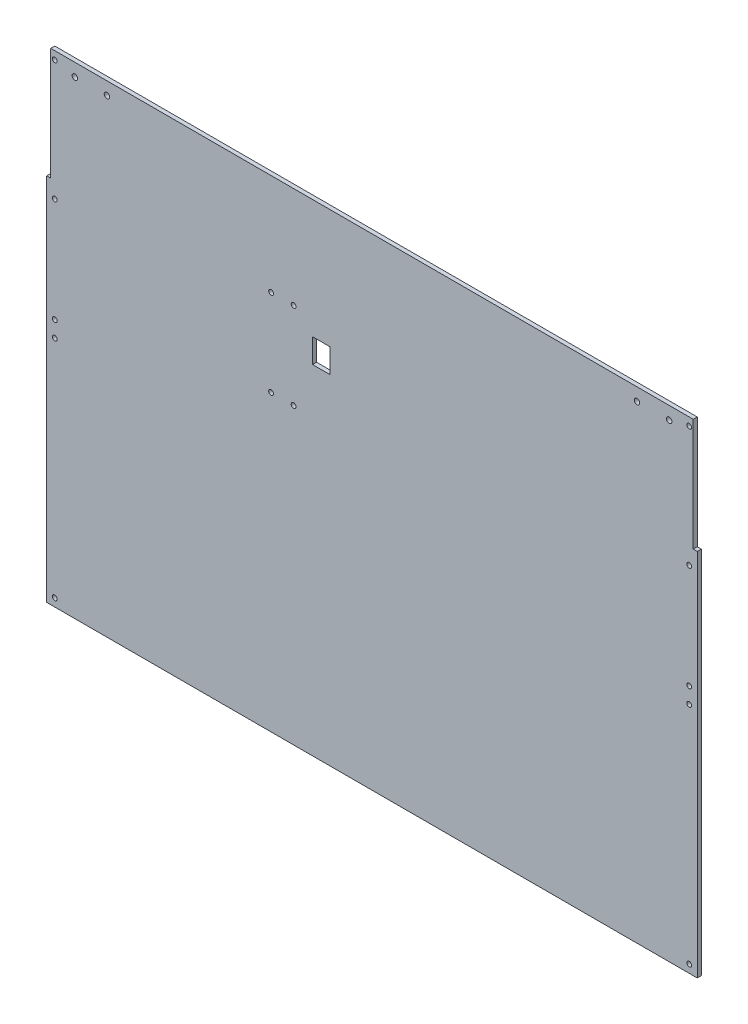
ISO-10303-21;
HEADER;
FILE_DESCRIPTION(('STEP AP214'),'2;1');
FILE_NAME('part.step','',(''),(''),'','','');
FILE_SCHEMA(('AUTOMOTIVE_DESIGN { 1 0 10303 214 1 1 1 1 }'));
ENDSEC;
DATA;
#1=APPLICATION_CONTEXT('core data for automotive mechanical design processes');
#2=APPLICATION_PROTOCOL_DEFINITION('international standard','automotive_design',2000,#1);
#3=PRODUCT_CONTEXT('',#1,'mechanical');
#4=PRODUCT('Part','Part','',(#3));
#5=PRODUCT_RELATED_PRODUCT_CATEGORY('part','',(#4));
#6=PRODUCT_DEFINITION_FORMATION('','',#4);
#7=PRODUCT_DEFINITION_CONTEXT('part definition',#1,'design');
#8=PRODUCT_DEFINITION('design','',#6,#7);
#9=PRODUCT_DEFINITION_SHAPE('','',#8);
#10=(LENGTH_UNIT() NAMED_UNIT(*) SI_UNIT(.MILLI.,.METRE.));
#11=(NAMED_UNIT(*) PLANE_ANGLE_UNIT() SI_UNIT($,.RADIAN.));
#12=(NAMED_UNIT(*) SI_UNIT($,.STERADIAN.) SOLID_ANGLE_UNIT());
#13=UNCERTAINTY_MEASURE_WITH_UNIT(LENGTH_MEASURE(1.E-05),#10,'distance_accuracy_value','');
#14=(GEOMETRIC_REPRESENTATION_CONTEXT(3) GLOBAL_UNCERTAINTY_ASSIGNED_CONTEXT((#13)) GLOBAL_UNIT_ASSIGNED_CONTEXT((#10,
#11,#12)) REPRESENTATION_CONTEXT('',''));
#15=CARTESIAN_POINT('',(0.,0.,0.));
#16=DIRECTION('',(0.,0.,1.));
#17=DIRECTION('',(1.,0.,0.));
#18=AXIS2_PLACEMENT_3D('',#15,#16,#17);
#19=CARTESIAN_POINT('',(254.,-190.5,3.175));
#20=DIRECTION('',(-1.,0.,0.));
#21=DIRECTION('',(0.,0.,1.));
#22=AXIS2_PLACEMENT_3D('',#19,#20,#21);
#23=PLANE('',#22);
#24=DIRECTION('',(0.,0.,1.));
#25=VECTOR('',#24,1.);
#26=CARTESIAN_POINT('',(254.,101.6,0.));
#27=LINE('',#26,#25);
#28=CARTESIAN_POINT('',(254.,101.6,0.));
#29=VERTEX_POINT('',#28);
#30=CARTESIAN_POINT('',(254.,101.6,3.175));
#31=VERTEX_POINT('',#30);
#32=EDGE_CURVE('E65',#29,#31,#27,.T.);
#33=ORIENTED_EDGE('',*,*,#32,.F.);
#34=DIRECTION('',(0.,1.,0.));
#35=VECTOR('',#34,1.);
#36=CARTESIAN_POINT('',(254.,-190.5,0.));
#37=LINE('',#36,#35);
#38=CARTESIAN_POINT('',(254.,190.5,0.));
#39=VERTEX_POINT('',#38);
#40=EDGE_CURVE('E295',#29,#39,#37,.T.);
#41=ORIENTED_EDGE('',*,*,#40,.T.);
#42=DIRECTION('',(0.,0.,-1.));
#43=VECTOR('',#42,1.);
#44=CARTESIAN_POINT('',(254.,190.5,3.175));
#45=LINE('',#44,#43);
#46=CARTESIAN_POINT('',(254.,190.5,3.175));
#47=VERTEX_POINT('',#46);
#48=EDGE_CURVE('E11',#47,#39,#45,.T.);
#49=ORIENTED_EDGE('',*,*,#48,.F.);
#50=DIRECTION('',(0.,1.,0.));
#51=VECTOR('',#50,1.);
#52=CARTESIAN_POINT('',(254.,-190.5,3.175));
#53=LINE('',#52,#51);
#54=EDGE_CURVE('E296',#31,#47,#53,.T.);
#55=ORIENTED_EDGE('',*,*,#54,.F.);
#56=EDGE_LOOP('',(#33,#41,#49,#55));
#57=FACE_BOUND('',#56,.T.);
#58=ADVANCED_FACE('F43',(#57),#23,.F.);
#59=CARTESIAN_POINT('',(-254.,190.5,3.175));
#60=DIRECTION('',(0.,-1.,0.));
#61=DIRECTION('',(0.,0.,-1.));
#62=AXIS2_PLACEMENT_3D('',#59,#60,#61);
#63=PLANE('',#62);
#64=DIRECTION('',(-1.,0.,0.));
#65=VECTOR('',#64,1.);
#66=CARTESIAN_POINT('',(-254.,190.5,0.));
#67=LINE('',#66,#65);
#68=CARTESIAN_POINT('',(-254.,190.5,0.));
#69=VERTEX_POINT('',#68);
#70=EDGE_CURVE('E303',#39,#69,#67,.T.);
#71=ORIENTED_EDGE('',*,*,#70,.T.);
#72=DIRECTION('',(0.,0.,-1.));
#73=VECTOR('',#72,1.);
#74=CARTESIAN_POINT('',(-254.,190.5,3.175));
#75=LINE('',#74,#73);
#76=CARTESIAN_POINT('',(-254.,190.5,3.175));
#77=VERTEX_POINT('',#76);
#78=EDGE_CURVE('E50',#77,#69,#75,.T.);
#79=ORIENTED_EDGE('',*,*,#78,.F.);
#80=DIRECTION('',(-1.,0.,0.));
#81=VECTOR('',#80,1.);
#82=CARTESIAN_POINT('',(-254.,190.5,3.175));
#83=LINE('',#82,#81);
#84=EDGE_CURVE('E298',#47,#77,#83,.T.);
#85=ORIENTED_EDGE('',*,*,#84,.F.);
#86=ORIENTED_EDGE('',*,*,#48,.T.);
#87=EDGE_LOOP('',(#71,#79,#85,#86));
#88=FACE_BOUND('',#87,.T.);
#89=ADVANCED_FACE('F419',(#88),#63,.F.);
#90=CARTESIAN_POINT('',(-254.,-190.5,3.175));
#91=DIRECTION('',(1.,0.,0.));
#92=DIRECTION('',(0.,0.,-1.));
#93=AXIS2_PLACEMENT_3D('',#90,#91,#92);
#94=PLANE('',#93);
#95=DIRECTION('',(0.,-1.,0.));
#96=VECTOR('',#95,1.);
#97=CARTESIAN_POINT('',(-254.,-190.5,0.));
#98=LINE('',#97,#96);
#99=CARTESIAN_POINT('',(-254.,101.6,0.));
#100=VERTEX_POINT('',#99);
#101=EDGE_CURVE('E305',#69,#100,#98,.T.);
#102=ORIENTED_EDGE('',*,*,#101,.T.);
#103=DIRECTION('',(0.,0.,1.));
#104=VECTOR('',#103,1.);
#105=CARTESIAN_POINT('',(-254.,101.6,0.));
#106=LINE('',#105,#104);
#107=CARTESIAN_POINT('',(-254.,101.6,3.175));
#108=VERTEX_POINT('',#107);
#109=EDGE_CURVE('E163',#100,#108,#106,.T.);
#110=ORIENTED_EDGE('',*,*,#109,.T.);
#111=DIRECTION('',(0.,-1.,0.));
#112=VECTOR('',#111,1.);
#113=CARTESIAN_POINT('',(-254.,-190.5,3.175));
#114=LINE('',#113,#112);
#115=EDGE_CURVE('E142',#77,#108,#114,.T.);
#116=ORIENTED_EDGE('',*,*,#115,.F.);
#117=ORIENTED_EDGE('',*,*,#78,.T.);
#118=EDGE_LOOP('',(#102,#110,#116,#117));
#119=FACE_BOUND('',#118,.T.);
#120=ADVANCED_FACE('F313',(#119),#94,.F.);
#121=CARTESIAN_POINT('',(-254.,-190.5,3.175));
#122=DIRECTION('',(0.,1.,0.));
#123=DIRECTION('',(0.,0.,1.));
#124=AXIS2_PLACEMENT_3D('',#121,#122,#123);
#125=PLANE('',#124);
#126=DIRECTION('',(1.,0.,0.));
#127=VECTOR('',#126,1.);
#128=CARTESIAN_POINT('',(-254.,-190.5,0.));
#129=LINE('',#128,#127);
#130=CARTESIAN_POINT('',(-257.175,-190.5,0.));
#131=VERTEX_POINT('',#130);
#132=CARTESIAN_POINT('',(257.175,-190.5,0.));
#133=VERTEX_POINT('',#132);
#134=EDGE_CURVE('E299',#131,#133,#129,.T.);
#135=ORIENTED_EDGE('',*,*,#134,.T.);
#136=DIRECTION('',(0.,0.,1.));
#137=VECTOR('',#136,1.);
#138=CARTESIAN_POINT('',(257.175,-190.5,0.));
#139=LINE('',#138,#137);
#140=CARTESIAN_POINT('',(257.175,-190.5,3.175));
#141=VERTEX_POINT('',#140);
#142=EDGE_CURVE('E137',#133,#141,#139,.T.);
#143=ORIENTED_EDGE('',*,*,#142,.T.);
#144=DIRECTION('',(1.,0.,0.));
#145=VECTOR('',#144,1.);
#146=CARTESIAN_POINT('',(-254.,-190.5,3.175));
#147=LINE('',#146,#145);
#148=CARTESIAN_POINT('',(-257.175,-190.5,3.175));
#149=VERTEX_POINT('',#148);
#150=EDGE_CURVE('E131',#149,#141,#147,.T.);
#151=ORIENTED_EDGE('',*,*,#150,.F.);
#152=DIRECTION('',(0.,0.,1.));
#153=VECTOR('',#152,1.);
#154=CARTESIAN_POINT('',(-257.175,-190.5,0.));
#155=LINE('',#154,#153);
#156=EDGE_CURVE('E134',#131,#149,#155,.T.);
#157=ORIENTED_EDGE('',*,*,#156,.F.);
#158=EDGE_LOOP('',(#135,#143,#151,#157));
#159=FACE_BOUND('',#158,.T.);
#160=ADVANCED_FACE('F133',(#159),#125,.F.);
#161=CARTESIAN_POINT('',(0.,0.,3.175));
#162=DIRECTION('',(0.,0.,-1.));
#163=DIRECTION('',(-1.,0.,0.));
#164=AXIS2_PLACEMENT_3D('',#161,#162,#163);
#165=PLANE('',#164);
#166=CARTESIAN_POINT('',(-234.95,180.34,3.175));
#167=DIRECTION('',(0.,0.,-1.));
#168=DIRECTION('',(-1.,0.,0.));
#169=AXIS2_PLACEMENT_3D('',#166,#167,#168);
#170=CIRCLE('',#169,2.15899999999999);
#171=CARTESIAN_POINT('',(-237.109,180.34,3.175));
#172=VERTEX_POINT('',#171);
#173=EDGE_CURVE('E151',#172,#172,#170,.T.);
#174=ORIENTED_EDGE('',*,*,#173,.T.);
#175=EDGE_LOOP('',(#174));
#176=FACE_BOUND('',#175,.T.);
#177=CARTESIAN_POINT('',(209.55,180.34,3.175));
#178=DIRECTION('',(0.,0.,-1.));
#179=DIRECTION('',(-1.,0.,0.));
#180=AXIS2_PLACEMENT_3D('',#177,#178,#179);
#181=CIRCLE('',#180,2.15899999999999);
#182=CARTESIAN_POINT('',(207.391,180.34,3.175));
#183=VERTEX_POINT('',#182);
#184=EDGE_CURVE('E337',#183,#183,#181,.T.);
#185=ORIENTED_EDGE('',*,*,#184,.T.);
#186=EDGE_LOOP('',(#185));
#187=FACE_BOUND('',#186,.T.);
#188=CARTESIAN_POINT('',(234.95,180.34,3.175));
#189=DIRECTION('',(0.,0.,-1.));
#190=DIRECTION('',(-1.,0.,0.));
#191=AXIS2_PLACEMENT_3D('',#188,#189,#190);
#192=CIRCLE('',#191,2.15899999999999);
#193=CARTESIAN_POINT('',(232.791,180.34,3.175));
#194=VERTEX_POINT('',#193);
#195=EDGE_CURVE('E323',#194,#194,#192,.T.);
#196=ORIENTED_EDGE('',*,*,#195,.T.);
#197=EDGE_LOOP('',(#196));
#198=FACE_BOUND('',#197,.T.);
#199=CARTESIAN_POINT('',(-209.55,180.34,3.175));
#200=DIRECTION('',(0.,0.,-1.));
#201=DIRECTION('',(-1.,0.,0.));
#202=AXIS2_PLACEMENT_3D('',#199,#200,#201);
#203=CIRCLE('',#202,2.15899999999999);
#204=CARTESIAN_POINT('',(-211.709,180.34,3.175));
#205=VERTEX_POINT('',#204);
#206=EDGE_CURVE('E330',#205,#205,#203,.T.);
#207=ORIENTED_EDGE('',*,*,#206,.T.);
#208=EDGE_LOOP('',(#207));
#209=FACE_BOUND('',#208,.T.);
#210=CARTESIAN_POINT('',(250.824999999962,6.34999999999699,3.175));
#211=DIRECTION('',(0.,0.,1.));
#212=DIRECTION('',(1.,0.,0.));
#213=AXIS2_PLACEMENT_3D('',#210,#211,#212);
#214=CIRCLE('',#213,1.90499999999999);
#215=CARTESIAN_POINT('',(252.729999999962,6.34999999999699,3.175));
#216=VERTEX_POINT('',#215);
#217=EDGE_CURVE('E229',#216,#216,#214,.T.);
#218=ORIENTED_EDGE('',*,*,#217,.F.);
#219=EDGE_LOOP('',(#218));
#220=FACE_BOUND('',#219,.T.);
#221=CARTESIAN_POINT('',(250.825,88.9,3.175));
#222=DIRECTION('',(0.,0.,1.));
#223=DIRECTION('',(1.,0.,0.));
#224=AXIS2_PLACEMENT_3D('',#221,#222,#223);
#225=CIRCLE('',#224,1.90499999999999);
#226=CARTESIAN_POINT('',(252.73,88.9,3.175));
#227=VERTEX_POINT('',#226);
#228=EDGE_CURVE('E223',#227,#227,#225,.T.);
#229=ORIENTED_EDGE('',*,*,#228,.F.);
#230=EDGE_LOOP('',(#229));
#231=FACE_BOUND('',#230,.T.);
#232=CARTESIAN_POINT('',(-250.825,-184.15,3.175));
#233=DIRECTION('',(0.,0.,1.));
#234=DIRECTION('',(-1.,0.,0.));
#235=AXIS2_PLACEMENT_3D('',#232,#233,#234);
#236=CIRCLE('',#235,1.90499999999999);
#237=CARTESIAN_POINT('',(-252.73,-184.15,3.175));
#238=VERTEX_POINT('',#237);
#239=EDGE_CURVE('E217',#238,#238,#236,.T.);
#240=ORIENTED_EDGE('',*,*,#239,.F.);
#241=EDGE_LOOP('',(#240));
#242=FACE_BOUND('',#241,.T.);
#243=CARTESIAN_POINT('',(250.825,-184.15,3.175));
#244=DIRECTION('',(0.,0.,1.));
#245=DIRECTION('',(1.,0.,0.));
#246=AXIS2_PLACEMENT_3D('',#243,#244,#245);
#247=CIRCLE('',#246,1.90499999999999);
#248=CARTESIAN_POINT('',(252.73,-184.15,3.175));
#249=VERTEX_POINT('',#248);
#250=EDGE_CURVE('E210',#249,#249,#247,.T.);
#251=ORIENTED_EDGE('',*,*,#250,.F.);
#252=EDGE_LOOP('',(#251));
#253=FACE_BOUND('',#252,.T.);
#254=CARTESIAN_POINT('',(-250.825,88.9000000000001,3.175));
#255=DIRECTION('',(0.,0.,1.));
#256=DIRECTION('',(-1.,0.,0.));
#257=AXIS2_PLACEMENT_3D('',#254,#255,#256);
#258=CIRCLE('',#257,1.90499999999999);
#259=CARTESIAN_POINT('',(-252.73,88.9000000000001,3.175));
#260=VERTEX_POINT('',#259);
#261=EDGE_CURVE('E246',#260,#260,#258,.T.);
#262=ORIENTED_EDGE('',*,*,#261,.F.);
#263=EDGE_LOOP('',(#262));
#264=FACE_BOUND('',#263,.T.);
#265=CARTESIAN_POINT('',(-250.824999999962,6.34999999999713,3.175));
#266=DIRECTION('',(0.,0.,1.));
#267=DIRECTION('',(-1.,0.,0.));
#268=AXIS2_PLACEMENT_3D('',#265,#266,#267);
#269=CIRCLE('',#268,1.90499999999999);
#270=CARTESIAN_POINT('',(-252.729999999962,6.34999999999713,3.175));
#271=VERTEX_POINT('',#270);
#272=EDGE_CURVE('E253',#271,#271,#269,.T.);
#273=ORIENTED_EDGE('',*,*,#272,.F.);
#274=EDGE_LOOP('',(#273));
#275=FACE_BOUND('',#274,.T.);
#276=CARTESIAN_POINT('',(-250.824999999999,-6.3499999999999,3.175));
#277=DIRECTION('',(0.,0.,1.));
#278=DIRECTION('',(-1.,0.,0.));
#279=AXIS2_PLACEMENT_3D('',#276,#277,#278);
#280=CIRCLE('',#279,1.90499999999999);
#281=CARTESIAN_POINT('',(-252.729999999999,-6.3499999999999,3.175));
#282=VERTEX_POINT('',#281);
#283=EDGE_CURVE('E234',#282,#282,#280,.T.);
#284=ORIENTED_EDGE('',*,*,#283,.F.);
#285=EDGE_LOOP('',(#284));
#286=FACE_BOUND('',#285,.T.);
#287=CARTESIAN_POINT('',(250.825,184.15,3.175));
#288=DIRECTION('',(0.,0.,1.));
#289=DIRECTION('',(1.,0.,0.));
#290=AXIS2_PLACEMENT_3D('',#287,#288,#289);
#291=CIRCLE('',#290,1.90499999999999);
#292=CARTESIAN_POINT('',(252.73,184.15,3.175));
#293=VERTEX_POINT('',#292);
#294=EDGE_CURVE('E241',#293,#293,#291,.T.);
#295=ORIENTED_EDGE('',*,*,#294,.F.);
#296=EDGE_LOOP('',(#295));
#297=FACE_BOUND('',#296,.T.);
#298=CARTESIAN_POINT('',(-79.774669,110.49,3.175));
#299=DIRECTION('',(0.,0.,1.));
#300=DIRECTION('',(1.,0.,0.));
#301=AXIS2_PLACEMENT_3D('',#298,#299,#300);
#302=CIRCLE('',#301,1.90499999999999);
#303=CARTESIAN_POINT('',(-77.8696690000001,110.49,3.175));
#304=VERTEX_POINT('',#303);
#305=EDGE_CURVE('E180',#304,#304,#302,.T.);
#306=ORIENTED_EDGE('',*,*,#305,.F.);
#307=EDGE_LOOP('',(#306));
#308=FACE_BOUND('',#307,.T.);
#309=CARTESIAN_POINT('',(-79.7746690000001,41.91,3.175));
#310=DIRECTION('',(0.,0.,1.));
#311=DIRECTION('',(1.,0.,0.));
#312=AXIS2_PLACEMENT_3D('',#309,#310,#311);
#313=CIRCLE('',#312,1.90499999999999);
#314=CARTESIAN_POINT('',(-77.8696690000001,41.91,3.175));
#315=VERTEX_POINT('',#314);
#316=EDGE_CURVE('E187',#315,#315,#313,.T.);
#317=ORIENTED_EDGE('',*,*,#316,.F.);
#318=EDGE_LOOP('',(#317));
#319=FACE_BOUND('',#318,.T.);
#320=CARTESIAN_POINT('',(-61.9946690000001,110.49,3.175));
#321=DIRECTION('',(0.,0.,1.));
#322=DIRECTION('',(1.,0.,0.));
#323=AXIS2_PLACEMENT_3D('',#320,#321,#322);
#324=CIRCLE('',#323,1.90499999999999);
#325=CARTESIAN_POINT('',(-60.0896690000001,110.49,3.175));
#326=VERTEX_POINT('',#325);
#327=EDGE_CURVE('E193',#326,#326,#324,.T.);
#328=ORIENTED_EDGE('',*,*,#327,.F.);
#329=EDGE_LOOP('',(#328));
#330=FACE_BOUND('',#329,.T.);
#331=CARTESIAN_POINT('',(-61.9946690000001,41.91,3.175));
#332=DIRECTION('',(0.,0.,1.));
#333=DIRECTION('',(1.,0.,0.));
#334=AXIS2_PLACEMENT_3D('',#331,#332,#333);
#335=CIRCLE('',#334,1.90499999999999);
#336=CARTESIAN_POINT('',(-60.0896690000001,41.91,3.175));
#337=VERTEX_POINT('',#336);
#338=EDGE_CURVE('E199',#337,#337,#335,.T.);
#339=ORIENTED_EDGE('',*,*,#338,.F.);
#340=EDGE_LOOP('',(#339));
#341=FACE_BOUND('',#340,.T.);
#342=CARTESIAN_POINT('',(250.824999999999,-6.35000000000004,3.175));
#343=DIRECTION('',(0.,0.,1.));
#344=DIRECTION('',(1.,0.,0.));
#345=AXIS2_PLACEMENT_3D('',#342,#343,#344);
#346=CIRCLE('',#345,1.90499999999999);
#347=CARTESIAN_POINT('',(252.729999999999,-6.35000000000004,3.175));
#348=VERTEX_POINT('',#347);
#349=EDGE_CURVE('E205',#348,#348,#346,.T.);
#350=ORIENTED_EDGE('',*,*,#349,.F.);
#351=EDGE_LOOP('',(#350));
#352=FACE_BOUND('',#351,.T.);
#353=CARTESIAN_POINT('',(-250.825,184.15,3.175));
#354=DIRECTION('',(0.,0.,1.));
#355=DIRECTION('',(-1.,0.,0.));
#356=AXIS2_PLACEMENT_3D('',#353,#354,#355);
#357=CIRCLE('',#356,1.90499999999999);
#358=CARTESIAN_POINT('',(-252.73,184.15,3.175));
#359=VERTEX_POINT('',#358);
#360=EDGE_CURVE('E249',#359,#359,#357,.T.);
#361=ORIENTED_EDGE('',*,*,#360,.F.);
#362=EDGE_LOOP('',(#361));
#363=FACE_BOUND('',#362,.T.);
#364=DIRECTION('',(0.,1.,0.));
#365=VECTOR('',#364,1.);
#366=CARTESIAN_POINT('',(-33.0200000000001,77.47,3.175));
#367=LINE('',#366,#365);
#368=CARTESIAN_POINT('',(-33.0200000000001,77.47,3.175));
#369=VERTEX_POINT('',#368);
#370=CARTESIAN_POINT('',(-33.0200000000001,96.52,3.175));
#371=VERTEX_POINT('',#370);
#372=EDGE_CURVE('E267',#369,#371,#367,.T.);
#373=ORIENTED_EDGE('',*,*,#372,.F.);
#374=DIRECTION('',(1.,0.,0.));
#375=VECTOR('',#374,1.);
#376=CARTESIAN_POINT('',(-46.9900000000001,77.47,3.175));
#377=LINE('',#376,#375);
#378=CARTESIAN_POINT('',(-46.9900000000001,77.47,3.175));
#379=VERTEX_POINT('',#378);
#380=EDGE_CURVE('E270',#379,#369,#377,.T.);
#381=ORIENTED_EDGE('',*,*,#380,.F.);
#382=DIRECTION('',(0.,-1.,0.));
#383=VECTOR('',#382,1.);
#384=CARTESIAN_POINT('',(-46.9900000000001,77.47,3.175));
#385=LINE('',#384,#383);
#386=CARTESIAN_POINT('',(-46.9900000000001,96.52,3.175));
#387=VERTEX_POINT('',#386);
#388=EDGE_CURVE('E261',#387,#379,#385,.T.);
#389=ORIENTED_EDGE('',*,*,#388,.F.);
#390=DIRECTION('',(-1.,0.,0.));
#391=VECTOR('',#390,1.);
#392=CARTESIAN_POINT('',(-46.9900000000001,96.52,3.175));
#393=LINE('',#392,#391);
#394=EDGE_CURVE('E264',#371,#387,#393,.T.);
#395=ORIENTED_EDGE('',*,*,#394,.F.);
#396=EDGE_LOOP('',(#373,#381,#389,#395));
#397=FACE_BOUND('',#396,.T.);
#398=ORIENTED_EDGE('',*,*,#150,.T.);
#399=DIRECTION('',(0.,1.,0.));
#400=VECTOR('',#399,1.);
#401=CARTESIAN_POINT('',(257.175,101.6,3.175));
#402=LINE('',#401,#400);
#403=CARTESIAN_POINT('',(257.175,101.6,3.175));
#404=VERTEX_POINT('',#403);
#405=EDGE_CURVE('E157',#141,#404,#402,.T.);
#406=ORIENTED_EDGE('',*,*,#405,.T.);
#407=DIRECTION('',(-1.,0.,0.));
#408=VECTOR('',#407,1.);
#409=CARTESIAN_POINT('',(254.,101.6,3.175));
#410=LINE('',#409,#408);
#411=EDGE_CURVE('E169',#404,#31,#410,.T.);
#412=ORIENTED_EDGE('',*,*,#411,.T.);
#413=ORIENTED_EDGE('',*,*,#54,.T.);
#414=ORIENTED_EDGE('',*,*,#84,.T.);
#415=ORIENTED_EDGE('',*,*,#115,.T.);
#416=DIRECTION('',(-1.,0.,0.));
#417=VECTOR('',#416,1.);
#418=CARTESIAN_POINT('',(-254.,101.6,3.175));
#419=LINE('',#418,#417);
#420=CARTESIAN_POINT('',(-257.175,101.6,3.175));
#421=VERTEX_POINT('',#420);
#422=EDGE_CURVE('E57',#108,#421,#419,.T.);
#423=ORIENTED_EDGE('',*,*,#422,.T.);
#424=DIRECTION('',(0.,-1.,0.));
#425=VECTOR('',#424,1.);
#426=CARTESIAN_POINT('',(-257.175,101.6,3.175));
#427=LINE('',#426,#425);
#428=EDGE_CURVE('E147',#421,#149,#427,.T.);
#429=ORIENTED_EDGE('',*,*,#428,.T.);
#430=EDGE_LOOP('',(#398,#406,#412,#413,#414,#415,#423,#429));
#431=FACE_BOUND('',#430,.T.);
#432=ADVANCED_FACE('F153',(#176,#187,#198,#209,#220,#231,#242,#253,#264,#275,#286,#297,#308,
#319,#330,#341,#352,#363,#397,#431),#165,.F.);
#433=CARTESIAN_POINT('',(0.,0.,0.));
#434=DIRECTION('',(0.,0.,-1.));
#435=DIRECTION('',(-1.,0.,0.));
#436=AXIS2_PLACEMENT_3D('',#433,#434,#435);
#437=PLANE('',#436);
#438=CARTESIAN_POINT('',(-234.95,180.34,0.));
#439=DIRECTION('',(0.,0.,-1.));
#440=DIRECTION('',(-1.,0.,0.));
#441=AXIS2_PLACEMENT_3D('',#438,#439,#440);
#442=CIRCLE('',#441,2.15899999999999);
#443=CARTESIAN_POINT('',(-237.109,180.34,0.));
#444=VERTEX_POINT('',#443);
#445=EDGE_CURVE('E336',#444,#444,#442,.T.);
#446=ORIENTED_EDGE('',*,*,#445,.F.);
#447=EDGE_LOOP('',(#446));
#448=FACE_BOUND('',#447,.T.);
#449=CARTESIAN_POINT('',(209.55,180.34,0.));
#450=DIRECTION('',(0.,0.,-1.));
#451=DIRECTION('',(-1.,0.,0.));
#452=AXIS2_PLACEMENT_3D('',#449,#450,#451);
#453=CIRCLE('',#452,2.15899999999999);
#454=CARTESIAN_POINT('',(207.391,180.34,0.));
#455=VERTEX_POINT('',#454);
#456=EDGE_CURVE('E327',#455,#455,#453,.T.);
#457=ORIENTED_EDGE('',*,*,#456,.F.);
#458=EDGE_LOOP('',(#457));
#459=FACE_BOUND('',#458,.T.);
#460=CARTESIAN_POINT('',(234.95,180.34,0.));
#461=DIRECTION('',(0.,0.,-1.));
#462=DIRECTION('',(-1.,0.,0.));
#463=AXIS2_PLACEMENT_3D('',#460,#461,#462);
#464=CIRCLE('',#463,2.15899999999999);
#465=CARTESIAN_POINT('',(232.791,180.34,0.));
#466=VERTEX_POINT('',#465);
#467=EDGE_CURVE('E326',#466,#466,#464,.T.);
#468=ORIENTED_EDGE('',*,*,#467,.F.);
#469=EDGE_LOOP('',(#468));
#470=FACE_BOUND('',#469,.T.);
#471=CARTESIAN_POINT('',(-209.55,180.34,0.));
#472=DIRECTION('',(0.,0.,-1.));
#473=DIRECTION('',(-1.,0.,0.));
#474=AXIS2_PLACEMENT_3D('',#471,#472,#473);
#475=CIRCLE('',#474,2.15899999999999);
#476=CARTESIAN_POINT('',(-211.709,180.34,0.));
#477=VERTEX_POINT('',#476);
#478=EDGE_CURVE('E333',#477,#477,#475,.T.);
#479=ORIENTED_EDGE('',*,*,#478,.F.);
#480=EDGE_LOOP('',(#479));
#481=FACE_BOUND('',#480,.T.);
#482=CARTESIAN_POINT('',(250.824999999962,6.34999999999699,0.));
#483=DIRECTION('',(0.,0.,1.));
#484=DIRECTION('',(1.,0.,0.));
#485=AXIS2_PLACEMENT_3D('',#482,#483,#484);
#486=CIRCLE('',#485,1.90499999999999);
#487=CARTESIAN_POINT('',(252.729999999962,6.34999999999699,0.));
#488=VERTEX_POINT('',#487);
#489=EDGE_CURVE('E183',#488,#488,#486,.T.);
#490=ORIENTED_EDGE('',*,*,#489,.T.);
#491=EDGE_LOOP('',(#490));
#492=FACE_BOUND('',#491,.T.);
#493=CARTESIAN_POINT('',(250.825,88.9,0.));
#494=DIRECTION('',(0.,0.,1.));
#495=DIRECTION('',(1.,0.,0.));
#496=AXIS2_PLACEMENT_3D('',#493,#494,#495);
#497=CIRCLE('',#496,1.90499999999999);
#498=CARTESIAN_POINT('',(252.73,88.9,0.));
#499=VERTEX_POINT('',#498);
#500=EDGE_CURVE('E226',#499,#499,#497,.T.);
#501=ORIENTED_EDGE('',*,*,#500,.T.);
#502=EDGE_LOOP('',(#501));
#503=FACE_BOUND('',#502,.T.);
#504=CARTESIAN_POINT('',(-250.825,-184.15,0.));
#505=DIRECTION('',(0.,0.,1.));
#506=DIRECTION('',(-1.,0.,0.));
#507=AXIS2_PLACEMENT_3D('',#504,#505,#506);
#508=CIRCLE('',#507,1.90499999999999);
#509=CARTESIAN_POINT('',(-252.73,-184.15,0.));
#510=VERTEX_POINT('',#509);
#511=EDGE_CURVE('E220',#510,#510,#508,.T.);
#512=ORIENTED_EDGE('',*,*,#511,.T.);
#513=EDGE_LOOP('',(#512));
#514=FACE_BOUND('',#513,.T.);
#515=CARTESIAN_POINT('',(250.825,-184.15,0.));
#516=DIRECTION('',(0.,0.,1.));
#517=DIRECTION('',(1.,0.,0.));
#518=AXIS2_PLACEMENT_3D('',#515,#516,#517);
#519=CIRCLE('',#518,1.90499999999999);
#520=CARTESIAN_POINT('',(252.73,-184.15,0.));
#521=VERTEX_POINT('',#520);
#522=EDGE_CURVE('E214',#521,#521,#519,.T.);
#523=ORIENTED_EDGE('',*,*,#522,.T.);
#524=EDGE_LOOP('',(#523));
#525=FACE_BOUND('',#524,.T.);
#526=CARTESIAN_POINT('',(-250.825,88.9000000000001,0.));
#527=DIRECTION('',(0.,0.,1.));
#528=DIRECTION('',(-1.,0.,0.));
#529=AXIS2_PLACEMENT_3D('',#526,#527,#528);
#530=CIRCLE('',#529,1.90499999999999);
#531=CARTESIAN_POINT('',(-252.73,88.9000000000001,0.));
#532=VERTEX_POINT('',#531);
#533=EDGE_CURVE('E250',#532,#532,#530,.T.);
#534=ORIENTED_EDGE('',*,*,#533,.T.);
#535=EDGE_LOOP('',(#534));
#536=FACE_BOUND('',#535,.T.);
#537=CARTESIAN_POINT('',(-250.824999999962,6.34999999999713,0.));
#538=DIRECTION('',(0.,0.,1.));
#539=DIRECTION('',(-1.,0.,0.));
#540=AXIS2_PLACEMENT_3D('',#537,#538,#539);
#541=CIRCLE('',#540,1.90499999999999);
#542=CARTESIAN_POINT('',(-252.729999999962,6.34999999999713,0.));
#543=VERTEX_POINT('',#542);
#544=EDGE_CURVE('E237',#543,#543,#541,.T.);
#545=ORIENTED_EDGE('',*,*,#544,.T.);
#546=EDGE_LOOP('',(#545));
#547=FACE_BOUND('',#546,.T.);
#548=CARTESIAN_POINT('',(-250.824999999999,-6.3499999999999,0.));
#549=DIRECTION('',(0.,0.,1.));
#550=DIRECTION('',(-1.,0.,0.));
#551=AXIS2_PLACEMENT_3D('',#548,#549,#550);
#552=CIRCLE('',#551,1.90499999999999);
#553=CARTESIAN_POINT('',(-252.729999999999,-6.3499999999999,0.));
#554=VERTEX_POINT('',#553);
#555=EDGE_CURVE('E238',#554,#554,#552,.T.);
#556=ORIENTED_EDGE('',*,*,#555,.T.);
#557=EDGE_LOOP('',(#556));
#558=FACE_BOUND('',#557,.T.);
#559=CARTESIAN_POINT('',(250.825,184.15,0.));
#560=DIRECTION('',(0.,0.,1.));
#561=DIRECTION('',(1.,0.,0.));
#562=AXIS2_PLACEMENT_3D('',#559,#560,#561);
#563=CIRCLE('',#562,1.90499999999999);
#564=CARTESIAN_POINT('',(252.73,184.15,0.));
#565=VERTEX_POINT('',#564);
#566=EDGE_CURVE('E213',#565,#565,#563,.T.);
#567=ORIENTED_EDGE('',*,*,#566,.T.);
#568=EDGE_LOOP('',(#567));
#569=FACE_BOUND('',#568,.T.);
#570=CARTESIAN_POINT('',(-79.774669,110.49,0.));
#571=DIRECTION('',(0.,0.,1.));
#572=DIRECTION('',(1.,0.,0.));
#573=AXIS2_PLACEMENT_3D('',#570,#571,#572);
#574=CIRCLE('',#573,1.90499999999999);
#575=CARTESIAN_POINT('',(-77.8696690000001,110.49,0.));
#576=VERTEX_POINT('',#575);
#577=EDGE_CURVE('E184',#576,#576,#574,.T.);
#578=ORIENTED_EDGE('',*,*,#577,.T.);
#579=EDGE_LOOP('',(#578));
#580=FACE_BOUND('',#579,.T.);
#581=CARTESIAN_POINT('',(-79.7746690000001,41.91,0.));
#582=DIRECTION('',(0.,0.,1.));
#583=DIRECTION('',(1.,0.,0.));
#584=AXIS2_PLACEMENT_3D('',#581,#582,#583);
#585=CIRCLE('',#584,1.90499999999999);
#586=CARTESIAN_POINT('',(-77.8696690000001,41.91,0.));
#587=VERTEX_POINT('',#586);
#588=EDGE_CURVE('E190',#587,#587,#585,.T.);
#589=ORIENTED_EDGE('',*,*,#588,.T.);
#590=EDGE_LOOP('',(#589));
#591=FACE_BOUND('',#590,.T.);
#592=CARTESIAN_POINT('',(-61.9946690000001,110.49,0.));
#593=DIRECTION('',(0.,0.,1.));
#594=DIRECTION('',(1.,0.,0.));
#595=AXIS2_PLACEMENT_3D('',#592,#593,#594);
#596=CIRCLE('',#595,1.90499999999999);
#597=CARTESIAN_POINT('',(-60.0896690000001,110.49,0.));
#598=VERTEX_POINT('',#597);
#599=EDGE_CURVE('E196',#598,#598,#596,.T.);
#600=ORIENTED_EDGE('',*,*,#599,.T.);
#601=EDGE_LOOP('',(#600));
#602=FACE_BOUND('',#601,.T.);
#603=CARTESIAN_POINT('',(-61.9946690000001,41.91,0.));
#604=DIRECTION('',(0.,0.,1.));
#605=DIRECTION('',(1.,0.,0.));
#606=AXIS2_PLACEMENT_3D('',#603,#604,#605);
#607=CIRCLE('',#606,1.90499999999999);
#608=CARTESIAN_POINT('',(-60.0896690000001,41.91,0.));
#609=VERTEX_POINT('',#608);
#610=EDGE_CURVE('E202',#609,#609,#607,.T.);
#611=ORIENTED_EDGE('',*,*,#610,.T.);
#612=EDGE_LOOP('',(#611));
#613=FACE_BOUND('',#612,.T.);
#614=CARTESIAN_POINT('',(250.824999999999,-6.35000000000004,0.));
#615=DIRECTION('',(0.,0.,1.));
#616=DIRECTION('',(1.,0.,0.));
#617=AXIS2_PLACEMENT_3D('',#614,#615,#616);
#618=CIRCLE('',#617,1.90499999999999);
#619=CARTESIAN_POINT('',(252.729999999999,-6.35000000000004,0.));
#620=VERTEX_POINT('',#619);
#621=EDGE_CURVE('E176',#620,#620,#618,.T.);
#622=ORIENTED_EDGE('',*,*,#621,.T.);
#623=EDGE_LOOP('',(#622));
#624=FACE_BOUND('',#623,.T.);
#625=CARTESIAN_POINT('',(-250.825,184.15,0.));
#626=DIRECTION('',(0.,0.,1.));
#627=DIRECTION('',(-1.,0.,0.));
#628=AXIS2_PLACEMENT_3D('',#625,#626,#627);
#629=CIRCLE('',#628,1.90499999999999);
#630=CARTESIAN_POINT('',(-252.73,184.15,0.));
#631=VERTEX_POINT('',#630);
#632=EDGE_CURVE('E258',#631,#631,#629,.T.);
#633=ORIENTED_EDGE('',*,*,#632,.T.);
#634=EDGE_LOOP('',(#633));
#635=FACE_BOUND('',#634,.T.);
#636=DIRECTION('',(1.,0.,0.));
#637=VECTOR('',#636,1.);
#638=CARTESIAN_POINT('',(-46.9900000000001,77.47,0.));
#639=LINE('',#638,#637);
#640=CARTESIAN_POINT('',(-46.9900000000001,77.47,0.));
#641=VERTEX_POINT('',#640);
#642=CARTESIAN_POINT('',(-33.0200000000001,77.47,0.));
#643=VERTEX_POINT('',#642);
#644=EDGE_CURVE('E266',#641,#643,#639,.T.);
#645=ORIENTED_EDGE('',*,*,#644,.T.);
#646=DIRECTION('',(0.,1.,0.));
#647=VECTOR('',#646,1.);
#648=CARTESIAN_POINT('',(-33.0200000000001,77.47,0.));
#649=LINE('',#648,#647);
#650=CARTESIAN_POINT('',(-33.0200000000001,96.52,0.));
#651=VERTEX_POINT('',#650);
#652=EDGE_CURVE('E287',#643,#651,#649,.T.);
#653=ORIENTED_EDGE('',*,*,#652,.T.);
#654=DIRECTION('',(-1.,0.,0.));
#655=VECTOR('',#654,1.);
#656=CARTESIAN_POINT('',(-46.9900000000001,96.52,0.));
#657=LINE('',#656,#655);
#658=CARTESIAN_POINT('',(-46.9900000000001,96.52,0.));
#659=VERTEX_POINT('',#658);
#660=EDGE_CURVE('E283',#651,#659,#657,.T.);
#661=ORIENTED_EDGE('',*,*,#660,.T.);
#662=DIRECTION('',(0.,-1.,0.));
#663=VECTOR('',#662,1.);
#664=CARTESIAN_POINT('',(-46.9900000000001,77.47,0.));
#665=LINE('',#664,#663);
#666=EDGE_CURVE('E278',#659,#641,#665,.T.);
#667=ORIENTED_EDGE('',*,*,#666,.T.);
#668=EDGE_LOOP('',(#645,#653,#661,#667));
#669=FACE_BOUND('',#668,.T.);
#670=ORIENTED_EDGE('',*,*,#40,.F.);
#671=DIRECTION('',(-1.,0.,0.));
#672=VECTOR('',#671,1.);
#673=CARTESIAN_POINT('',(254.,101.6,0.));
#674=LINE('',#673,#672);
#675=CARTESIAN_POINT('',(257.175,101.6,0.));
#676=VERTEX_POINT('',#675);
#677=EDGE_CURVE('E168',#676,#29,#674,.T.);
#678=ORIENTED_EDGE('',*,*,#677,.F.);
#679=DIRECTION('',(0.,1.,0.));
#680=VECTOR('',#679,1.);
#681=CARTESIAN_POINT('',(257.175,101.6,0.));
#682=LINE('',#681,#680);
#683=EDGE_CURVE('E165',#133,#676,#682,.T.);
#684=ORIENTED_EDGE('',*,*,#683,.F.);
#685=ORIENTED_EDGE('',*,*,#134,.F.);
#686=DIRECTION('',(0.,-1.,0.));
#687=VECTOR('',#686,1.);
#688=CARTESIAN_POINT('',(-257.175,101.6,0.));
#689=LINE('',#688,#687);
#690=CARTESIAN_POINT('',(-257.175,101.6,0.));
#691=VERTEX_POINT('',#690);
#692=EDGE_CURVE('E149',#691,#131,#689,.T.);
#693=ORIENTED_EDGE('',*,*,#692,.F.);
#694=DIRECTION('',(-1.,0.,0.));
#695=VECTOR('',#694,1.);
#696=CARTESIAN_POINT('',(-254.,101.6,0.));
#697=LINE('',#696,#695);
#698=EDGE_CURVE('E155',#100,#691,#697,.T.);
#699=ORIENTED_EDGE('',*,*,#698,.F.);
#700=ORIENTED_EDGE('',*,*,#101,.F.);
#701=ORIENTED_EDGE('',*,*,#70,.F.);
#702=EDGE_LOOP('',(#670,#678,#684,#685,#693,#699,#700,#701));
#703=FACE_BOUND('',#702,.T.);
#704=ADVANCED_FACE('F319',(#448,#459,#470,#481,#492,#503,#514,#525,#536,#547,#558,#569,#580,
#591,#602,#613,#624,#635,#669,#703),#437,.T.);
#705=CARTESIAN_POINT('',(-46.9900000000001,77.47,-23.6233655519276));
#706=DIRECTION('',(0.,-1.,0.));
#707=DIRECTION('',(0.,0.,-1.));
#708=AXIS2_PLACEMENT_3D('',#705,#706,#707);
#709=PLANE('',#708);
#710=DIRECTION('',(0.,0.,1.));
#711=VECTOR('',#710,1.);
#712=CARTESIAN_POINT('',(-46.9900000000001,77.47,-23.6233655519276));
#713=LINE('',#712,#711);
#714=EDGE_CURVE('E281',#641,#379,#713,.T.);
#715=ORIENTED_EDGE('',*,*,#714,.T.);
#716=ORIENTED_EDGE('',*,*,#380,.T.);
#717=DIRECTION('',(0.,0.,1.));
#718=VECTOR('',#717,1.);
#719=CARTESIAN_POINT('',(-33.0200000000001,77.47,-23.6233655519276));
#720=LINE('',#719,#718);
#721=EDGE_CURVE('E277',#643,#369,#720,.T.);
#722=ORIENTED_EDGE('',*,*,#721,.F.);
#723=ORIENTED_EDGE('',*,*,#644,.F.);
#724=EDGE_LOOP('',(#715,#716,#722,#723));
#725=FACE_BOUND('',#724,.T.);
#726=ADVANCED_FACE('F358',(#725),#709,.F.);
#727=CARTESIAN_POINT('',(-33.0200000000001,77.47,-23.6233655519276));
#728=DIRECTION('',(1.,0.,0.));
#729=DIRECTION('',(0.,0.,-1.));
#730=AXIS2_PLACEMENT_3D('',#727,#728,#729);
#731=PLANE('',#730);
#732=ORIENTED_EDGE('',*,*,#721,.T.);
#733=ORIENTED_EDGE('',*,*,#372,.T.);
#734=DIRECTION('',(0.,0.,1.));
#735=VECTOR('',#734,1.);
#736=CARTESIAN_POINT('',(-33.0200000000001,96.52,-23.6233655519276));
#737=LINE('',#736,#735);
#738=EDGE_CURVE('E286',#651,#371,#737,.T.);
#739=ORIENTED_EDGE('',*,*,#738,.F.);
#740=ORIENTED_EDGE('',*,*,#652,.F.);
#741=EDGE_LOOP('',(#732,#733,#739,#740));
#742=FACE_BOUND('',#741,.T.);
#743=ADVANCED_FACE('F400',(#742),#731,.F.);
#744=CARTESIAN_POINT('',(-46.9900000000001,96.52,-23.6233655519276));
#745=DIRECTION('',(0.,1.,0.));
#746=DIRECTION('',(0.,0.,1.));
#747=AXIS2_PLACEMENT_3D('',#744,#745,#746);
#748=PLANE('',#747);
#749=ORIENTED_EDGE('',*,*,#738,.T.);
#750=ORIENTED_EDGE('',*,*,#394,.T.);
#751=DIRECTION('',(0.,0.,1.));
#752=VECTOR('',#751,1.);
#753=CARTESIAN_POINT('',(-46.9900000000001,96.52,-23.6233655519276));
#754=LINE('',#753,#752);
#755=EDGE_CURVE('E282',#659,#387,#754,.T.);
#756=ORIENTED_EDGE('',*,*,#755,.F.);
#757=ORIENTED_EDGE('',*,*,#660,.F.);
#758=EDGE_LOOP('',(#749,#750,#756,#757));
#759=FACE_BOUND('',#758,.T.);
#760=ADVANCED_FACE('F404',(#759),#748,.F.);
#761=CARTESIAN_POINT('',(-46.9900000000001,77.47,-23.6233655519276));
#762=DIRECTION('',(-1.,0.,0.));
#763=DIRECTION('',(0.,0.,1.));
#764=AXIS2_PLACEMENT_3D('',#761,#762,#763);
#765=PLANE('',#764);
#766=ORIENTED_EDGE('',*,*,#755,.T.);
#767=ORIENTED_EDGE('',*,*,#388,.T.);
#768=ORIENTED_EDGE('',*,*,#714,.F.);
#769=ORIENTED_EDGE('',*,*,#666,.F.);
#770=EDGE_LOOP('',(#766,#767,#768,#769));
#771=FACE_BOUND('',#770,.T.);
#772=ADVANCED_FACE('F408',(#771),#765,.F.);
#773=CARTESIAN_POINT('',(-250.825,184.15,0.));
#774=DIRECTION('',(0.,0.,1.));
#775=DIRECTION('',(1.,0.,0.));
#776=AXIS2_PLACEMENT_3D('',#773,#774,#775);
#777=CYLINDRICAL_SURFACE('',#776,1.90499999999999);
#778=ORIENTED_EDGE('',*,*,#632,.F.);
#779=EDGE_LOOP('',(#778));
#780=FACE_BOUND('',#779,.T.);
#781=ORIENTED_EDGE('',*,*,#360,.T.);
#782=EDGE_LOOP('',(#781));
#783=FACE_BOUND('',#782,.T.);
#784=ADVANCED_FACE('F465',(#780,#783),#777,.F.);
#785=CARTESIAN_POINT('',(250.824999999999,-6.35000000000004,0.));
#786=DIRECTION('',(0.,0.,1.));
#787=DIRECTION('',(1.,0.,0.));
#788=AXIS2_PLACEMENT_3D('',#785,#786,#787);
#789=CYLINDRICAL_SURFACE('',#788,1.90499999999999);
#790=ORIENTED_EDGE('',*,*,#621,.F.);
#791=EDGE_LOOP('',(#790));
#792=FACE_BOUND('',#791,.T.);
#793=ORIENTED_EDGE('',*,*,#349,.T.);
#794=EDGE_LOOP('',(#793));
#795=FACE_BOUND('',#794,.T.);
#796=ADVANCED_FACE('F461',(#792,#795),#789,.F.);
#797=CARTESIAN_POINT('',(-61.9946690000001,41.91,0.));
#798=DIRECTION('',(0.,0.,1.));
#799=DIRECTION('',(1.,0.,0.));
#800=AXIS2_PLACEMENT_3D('',#797,#798,#799);
#801=CYLINDRICAL_SURFACE('',#800,1.90499999999999);
#802=ORIENTED_EDGE('',*,*,#610,.F.);
#803=EDGE_LOOP('',(#802));
#804=FACE_BOUND('',#803,.T.);
#805=ORIENTED_EDGE('',*,*,#338,.T.);
#806=EDGE_LOOP('',(#805));
#807=FACE_BOUND('',#806,.T.);
#808=ADVANCED_FACE('F457',(#804,#807),#801,.F.);
#809=CARTESIAN_POINT('',(-61.9946690000001,110.49,0.));
#810=DIRECTION('',(0.,0.,1.));
#811=DIRECTION('',(1.,0.,0.));
#812=AXIS2_PLACEMENT_3D('',#809,#810,#811);
#813=CYLINDRICAL_SURFACE('',#812,1.90499999999999);
#814=ORIENTED_EDGE('',*,*,#599,.F.);
#815=EDGE_LOOP('',(#814));
#816=FACE_BOUND('',#815,.T.);
#817=ORIENTED_EDGE('',*,*,#327,.T.);
#818=EDGE_LOOP('',(#817));
#819=FACE_BOUND('',#818,.T.);
#820=ADVANCED_FACE('F453',(#816,#819),#813,.F.);
#821=CARTESIAN_POINT('',(-79.7746690000001,41.91,0.));
#822=DIRECTION('',(0.,0.,1.));
#823=DIRECTION('',(1.,0.,0.));
#824=AXIS2_PLACEMENT_3D('',#821,#822,#823);
#825=CYLINDRICAL_SURFACE('',#824,1.90499999999999);
#826=ORIENTED_EDGE('',*,*,#588,.F.);
#827=EDGE_LOOP('',(#826));
#828=FACE_BOUND('',#827,.T.);
#829=ORIENTED_EDGE('',*,*,#316,.T.);
#830=EDGE_LOOP('',(#829));
#831=FACE_BOUND('',#830,.T.);
#832=ADVANCED_FACE('F449',(#828,#831),#825,.F.);
#833=CARTESIAN_POINT('',(-79.774669,110.49,0.));
#834=DIRECTION('',(0.,0.,1.));
#835=DIRECTION('',(1.,0.,0.));
#836=AXIS2_PLACEMENT_3D('',#833,#834,#835);
#837=CYLINDRICAL_SURFACE('',#836,1.90499999999999);
#838=ORIENTED_EDGE('',*,*,#577,.F.);
#839=EDGE_LOOP('',(#838));
#840=FACE_BOUND('',#839,.T.);
#841=ORIENTED_EDGE('',*,*,#305,.T.);
#842=EDGE_LOOP('',(#841));
#843=FACE_BOUND('',#842,.T.);
#844=ADVANCED_FACE('F445',(#840,#843),#837,.F.);
#845=CARTESIAN_POINT('',(250.825,184.15,0.));
#846=DIRECTION('',(0.,0.,1.));
#847=DIRECTION('',(1.,0.,0.));
#848=AXIS2_PLACEMENT_3D('',#845,#846,#847);
#849=CYLINDRICAL_SURFACE('',#848,1.90499999999999);
#850=ORIENTED_EDGE('',*,*,#566,.F.);
#851=EDGE_LOOP('',(#850));
#852=FACE_BOUND('',#851,.T.);
#853=ORIENTED_EDGE('',*,*,#294,.T.);
#854=EDGE_LOOP('',(#853));
#855=FACE_BOUND('',#854,.T.);
#856=ADVANCED_FACE('F448',(#852,#855),#849,.F.);
#857=CARTESIAN_POINT('',(-250.824999999999,-6.3499999999999,0.));
#858=DIRECTION('',(0.,0.,1.));
#859=DIRECTION('',(1.,0.,0.));
#860=AXIS2_PLACEMENT_3D('',#857,#858,#859);
#861=CYLINDRICAL_SURFACE('',#860,1.90499999999999);
#862=ORIENTED_EDGE('',*,*,#555,.F.);
#863=EDGE_LOOP('',(#862));
#864=FACE_BOUND('',#863,.T.);
#865=ORIENTED_EDGE('',*,*,#283,.T.);
#866=EDGE_LOOP('',(#865));
#867=FACE_BOUND('',#866,.T.);
#868=ADVANCED_FACE('F483',(#864,#867),#861,.F.);
#869=CARTESIAN_POINT('',(-250.824999999962,6.34999999999713,0.));
#870=DIRECTION('',(0.,0.,1.));
#871=DIRECTION('',(1.,0.,0.));
#872=AXIS2_PLACEMENT_3D('',#869,#870,#871);
#873=CYLINDRICAL_SURFACE('',#872,1.90499999999999);
#874=ORIENTED_EDGE('',*,*,#544,.F.);
#875=EDGE_LOOP('',(#874));
#876=FACE_BOUND('',#875,.T.);
#877=ORIENTED_EDGE('',*,*,#272,.T.);
#878=EDGE_LOOP('',(#877));
#879=FACE_BOUND('',#878,.T.);
#880=ADVANCED_FACE('F486',(#876,#879),#873,.F.);
#881=CARTESIAN_POINT('',(-250.825,88.9000000000001,0.));
#882=DIRECTION('',(0.,0.,1.));
#883=DIRECTION('',(1.,0.,0.));
#884=AXIS2_PLACEMENT_3D('',#881,#882,#883);
#885=CYLINDRICAL_SURFACE('',#884,1.90499999999999);
#886=ORIENTED_EDGE('',*,*,#533,.F.);
#887=EDGE_LOOP('',(#886));
#888=FACE_BOUND('',#887,.T.);
#889=ORIENTED_EDGE('',*,*,#261,.T.);
#890=EDGE_LOOP('',(#889));
#891=FACE_BOUND('',#890,.T.);
#892=ADVANCED_FACE('F471',(#888,#891),#885,.F.);
#893=CARTESIAN_POINT('',(250.825,-184.15,0.));
#894=DIRECTION('',(0.,0.,1.));
#895=DIRECTION('',(1.,0.,0.));
#896=AXIS2_PLACEMENT_3D('',#893,#894,#895);
#897=CYLINDRICAL_SURFACE('',#896,1.90499999999999);
#898=ORIENTED_EDGE('',*,*,#522,.F.);
#899=EDGE_LOOP('',(#898));
#900=FACE_BOUND('',#899,.T.);
#901=ORIENTED_EDGE('',*,*,#250,.T.);
#902=EDGE_LOOP('',(#901));
#903=FACE_BOUND('',#902,.T.);
#904=ADVANCED_FACE('F467',(#900,#903),#897,.F.);
#905=CARTESIAN_POINT('',(-250.825,-184.15,0.));
#906=DIRECTION('',(0.,0.,1.));
#907=DIRECTION('',(1.,0.,0.));
#908=AXIS2_PLACEMENT_3D('',#905,#906,#907);
#909=CYLINDRICAL_SURFACE('',#908,1.90499999999999);
#910=ORIENTED_EDGE('',*,*,#511,.F.);
#911=EDGE_LOOP('',(#910));
#912=FACE_BOUND('',#911,.T.);
#913=ORIENTED_EDGE('',*,*,#239,.T.);
#914=EDGE_LOOP('',(#913));
#915=FACE_BOUND('',#914,.T.);
#916=ADVANCED_FACE('F470',(#912,#915),#909,.F.);
#917=CARTESIAN_POINT('',(250.825,88.9,0.));
#918=DIRECTION('',(0.,0.,1.));
#919=DIRECTION('',(1.,0.,0.));
#920=AXIS2_PLACEMENT_3D('',#917,#918,#919);
#921=CYLINDRICAL_SURFACE('',#920,1.90499999999999);
#922=ORIENTED_EDGE('',*,*,#500,.F.);
#923=EDGE_LOOP('',(#922));
#924=FACE_BOUND('',#923,.T.);
#925=ORIENTED_EDGE('',*,*,#228,.T.);
#926=EDGE_LOOP('',(#925));
#927=FACE_BOUND('',#926,.T.);
#928=ADVANCED_FACE('F475',(#924,#927),#921,.F.);
#929=CARTESIAN_POINT('',(250.824999999962,6.34999999999699,0.));
#930=DIRECTION('',(0.,0.,1.));
#931=DIRECTION('',(1.,0.,0.));
#932=AXIS2_PLACEMENT_3D('',#929,#930,#931);
#933=CYLINDRICAL_SURFACE('',#932,1.90499999999999);
#934=ORIENTED_EDGE('',*,*,#489,.F.);
#935=EDGE_LOOP('',(#934));
#936=FACE_BOUND('',#935,.T.);
#937=ORIENTED_EDGE('',*,*,#217,.T.);
#938=EDGE_LOOP('',(#937));
#939=FACE_BOUND('',#938,.T.);
#940=ADVANCED_FACE('F442',(#936,#939),#933,.F.);
#941=CARTESIAN_POINT('',(254.,101.6,0.));
#942=DIRECTION('',(0.,1.,0.));
#943=DIRECTION('',(-1.,0.,0.));
#944=AXIS2_PLACEMENT_3D('',#941,#942,#943);
#945=PLANE('',#944);
#946=ORIENTED_EDGE('',*,*,#411,.F.);
#947=DIRECTION('',(0.,0.,1.));
#948=VECTOR('',#947,1.);
#949=CARTESIAN_POINT('',(257.175,101.6,0.));
#950=LINE('',#949,#948);
#951=EDGE_CURVE('E177',#676,#404,#950,.T.);
#952=ORIENTED_EDGE('',*,*,#951,.F.);
#953=ORIENTED_EDGE('',*,*,#677,.T.);
#954=ORIENTED_EDGE('',*,*,#32,.T.);
#955=EDGE_LOOP('',(#946,#952,#953,#954));
#956=FACE_BOUND('',#955,.T.);
#957=ADVANCED_FACE('F432',(#956),#945,.T.);
#958=CARTESIAN_POINT('',(257.175,101.6,0.));
#959=DIRECTION('',(1.,0.,0.));
#960=DIRECTION('',(0.,1.,0.));
#961=AXIS2_PLACEMENT_3D('',#958,#959,#960);
#962=PLANE('',#961);
#963=ORIENTED_EDGE('',*,*,#405,.F.);
#964=ORIENTED_EDGE('',*,*,#142,.F.);
#965=ORIENTED_EDGE('',*,*,#683,.T.);
#966=ORIENTED_EDGE('',*,*,#951,.T.);
#967=EDGE_LOOP('',(#963,#964,#965,#966));
#968=FACE_BOUND('',#967,.T.);
#969=ADVANCED_FACE('F434',(#968),#962,.T.);
#970=CARTESIAN_POINT('',(-257.175,101.6,0.));
#971=DIRECTION('',(-1.,0.,0.));
#972=DIRECTION('',(0.,-1.,0.));
#973=AXIS2_PLACEMENT_3D('',#970,#971,#972);
#974=PLANE('',#973);
#975=ORIENTED_EDGE('',*,*,#428,.F.);
#976=DIRECTION('',(0.,0.,1.));
#977=VECTOR('',#976,1.);
#978=CARTESIAN_POINT('',(-257.175,101.6,0.));
#979=LINE('',#978,#977);
#980=EDGE_CURVE('E150',#691,#421,#979,.T.);
#981=ORIENTED_EDGE('',*,*,#980,.F.);
#982=ORIENTED_EDGE('',*,*,#692,.T.);
#983=ORIENTED_EDGE('',*,*,#156,.T.);
#984=EDGE_LOOP('',(#975,#981,#982,#983));
#985=FACE_BOUND('',#984,.T.);
#986=ADVANCED_FACE('F146',(#985),#974,.T.);
#987=CARTESIAN_POINT('',(-254.,101.6,0.));
#988=DIRECTION('',(0.,1.,0.));
#989=DIRECTION('',(-1.,0.,0.));
#990=AXIS2_PLACEMENT_3D('',#987,#988,#989);
#991=PLANE('',#990);
#992=ORIENTED_EDGE('',*,*,#422,.F.);
#993=ORIENTED_EDGE('',*,*,#109,.F.);
#994=ORIENTED_EDGE('',*,*,#698,.T.);
#995=ORIENTED_EDGE('',*,*,#980,.T.);
#996=EDGE_LOOP('',(#992,#993,#994,#995));
#997=FACE_BOUND('',#996,.T.);
#998=ADVANCED_FACE('F320',(#997),#991,.T.);
#999=CARTESIAN_POINT('',(-209.55,180.34,3.175));
#1000=DIRECTION('',(0.,0.,-1.));
#1001=DIRECTION('',(-1.,0.,0.));
#1002=AXIS2_PLACEMENT_3D('',#999,#1000,#1001);
#1003=CYLINDRICAL_SURFACE('',#1002,2.15899999999999);
#1004=ORIENTED_EDGE('',*,*,#206,.F.);
#1005=EDGE_LOOP('',(#1004));
#1006=FACE_BOUND('',#1005,.T.);
#1007=ORIENTED_EDGE('',*,*,#478,.T.);
#1008=EDGE_LOOP('',(#1007));
#1009=FACE_BOUND('',#1008,.T.);
#1010=ADVANCED_FACE('F607',(#1006,#1009),#1003,.F.);
#1011=CARTESIAN_POINT('',(234.95,180.34,3.175));
#1012=DIRECTION('',(0.,0.,-1.));
#1013=DIRECTION('',(-1.,0.,0.));
#1014=AXIS2_PLACEMENT_3D('',#1011,#1012,#1013);
#1015=CYLINDRICAL_SURFACE('',#1014,2.15899999999999);
#1016=ORIENTED_EDGE('',*,*,#195,.F.);
#1017=EDGE_LOOP('',(#1016));
#1018=FACE_BOUND('',#1017,.T.);
#1019=ORIENTED_EDGE('',*,*,#467,.T.);
#1020=EDGE_LOOP('',(#1019));
#1021=FACE_BOUND('',#1020,.T.);
#1022=ADVANCED_FACE('F618',(#1018,#1021),#1015,.F.);
#1023=CARTESIAN_POINT('',(209.55,180.34,3.175));
#1024=DIRECTION('',(0.,0.,-1.));
#1025=DIRECTION('',(-1.,0.,0.));
#1026=AXIS2_PLACEMENT_3D('',#1023,#1024,#1025);
#1027=CYLINDRICAL_SURFACE('',#1026,2.15899999999999);
#1028=ORIENTED_EDGE('',*,*,#184,.F.);
#1029=EDGE_LOOP('',(#1028));
#1030=FACE_BOUND('',#1029,.T.);
#1031=ORIENTED_EDGE('',*,*,#456,.T.);
#1032=EDGE_LOOP('',(#1031));
#1033=FACE_BOUND('',#1032,.T.);
#1034=ADVANCED_FACE('F352',(#1030,#1033),#1027,.F.);
#1035=CARTESIAN_POINT('',(-234.95,180.34,3.175));
#1036=DIRECTION('',(0.,0.,-1.));
#1037=DIRECTION('',(-1.,0.,0.));
#1038=AXIS2_PLACEMENT_3D('',#1035,#1036,#1037);
#1039=CYLINDRICAL_SURFACE('',#1038,2.15899999999999);
#1040=ORIENTED_EDGE('',*,*,#173,.F.);
#1041=EDGE_LOOP('',(#1040));
#1042=FACE_BOUND('',#1041,.T.);
#1043=ORIENTED_EDGE('',*,*,#445,.T.);
#1044=EDGE_LOOP('',(#1043));
#1045=FACE_BOUND('',#1044,.T.);
#1046=ADVANCED_FACE('F349',(#1042,#1045),#1039,.F.);
#1047=CLOSED_SHELL('',(#58,#89,#120,#160,#432,#704,#726,#743,#760,#772,#784,#796,#808,#820,#832,
#844,#856,#868,#880,#892,#904,#916,#928,#940,#957,#969,#986,#998,#1010,#1022,#1034,#1046));
#1048=MANIFOLD_SOLID_BREP('B2',#1047);
#1049=ADVANCED_BREP_SHAPE_REPRESENTATION('',(#18,#1048),#14);
#1050=SHAPE_DEFINITION_REPRESENTATION(#9,#1049);
ENDSEC;
END-ISO-10303-21;
